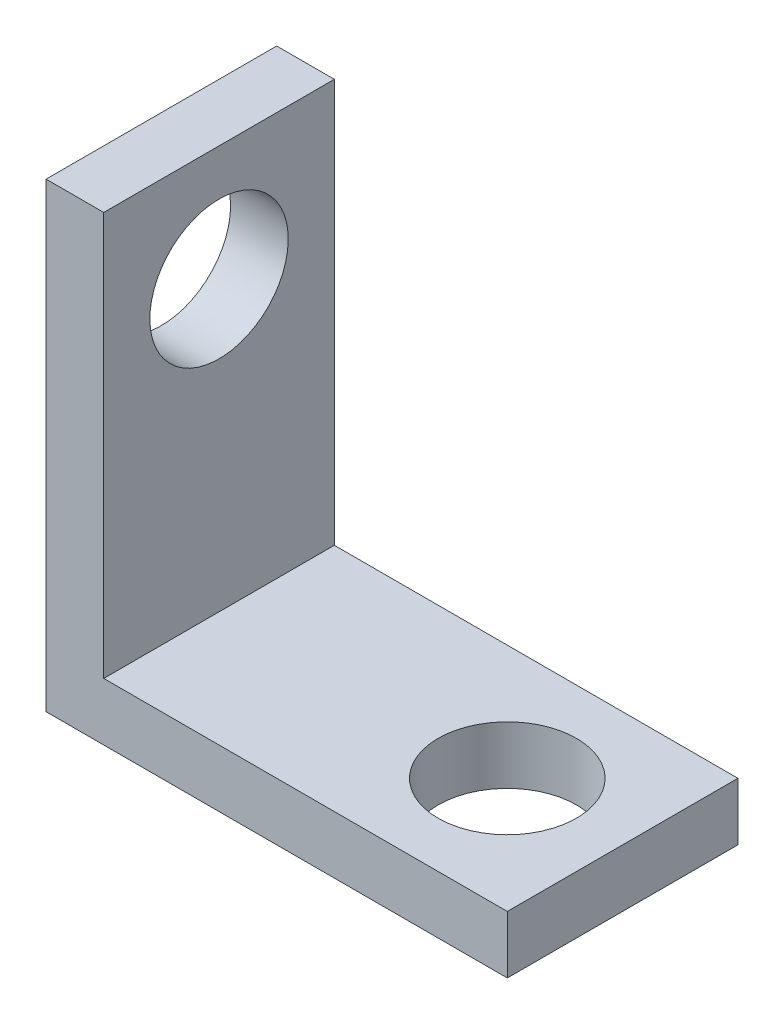
ISO-10303-21;
HEADER;
FILE_DESCRIPTION(('STEP AP214'),'2;1');
FILE_NAME('part.step','',(''),(''),'','','');
FILE_SCHEMA(('AUTOMOTIVE_DESIGN { 1 0 10303 214 1 1 1 1 }'));
ENDSEC;
DATA;
#1=APPLICATION_CONTEXT('core data for automotive mechanical design processes');
#2=APPLICATION_PROTOCOL_DEFINITION('international standard','automotive_design',2000,#1);
#3=PRODUCT_CONTEXT('',#1,'mechanical');
#4=PRODUCT('Part','Part','',(#3));
#5=PRODUCT_RELATED_PRODUCT_CATEGORY('part','',(#4));
#6=PRODUCT_DEFINITION_FORMATION('','',#4);
#7=PRODUCT_DEFINITION_CONTEXT('part definition',#1,'design');
#8=PRODUCT_DEFINITION('design','',#6,#7);
#9=PRODUCT_DEFINITION_SHAPE('','',#8);
#10=(LENGTH_UNIT() NAMED_UNIT(*) SI_UNIT(.MILLI.,.METRE.));
#11=(NAMED_UNIT(*) PLANE_ANGLE_UNIT() SI_UNIT($,.RADIAN.));
#12=(NAMED_UNIT(*) SI_UNIT($,.STERADIAN.) SOLID_ANGLE_UNIT());
#13=UNCERTAINTY_MEASURE_WITH_UNIT(LENGTH_MEASURE(1.E-05),#10,'distance_accuracy_value','');
#14=(GEOMETRIC_REPRESENTATION_CONTEXT(3) GLOBAL_UNCERTAINTY_ASSIGNED_CONTEXT((#13)) GLOBAL_UNIT_ASSIGNED_CONTEXT((#10,
#11,#12)) REPRESENTATION_CONTEXT('',''));
#15=CARTESIAN_POINT('',(0.,0.,0.));
#16=DIRECTION('',(0.,0.,1.));
#17=DIRECTION('',(1.,0.,0.));
#18=AXIS2_PLACEMENT_3D('',#15,#16,#17);
#19=CARTESIAN_POINT('',(25.4,0.,12.7));
#20=DIRECTION('',(0.,1.,0.));
#21=DIRECTION('',(-1.,0.,0.));
#22=AXIS2_PLACEMENT_3D('',#19,#20,#21);
#23=PLANE('',#22);
#24=CARTESIAN_POINT('',(19.05,0.,6.35));
#25=DIRECTION('',(0.,1.,0.));
#26=DIRECTION('',(-1.,0.,0.));
#27=AXIS2_PLACEMENT_3D('',#24,#25,#26);
#28=CIRCLE('',#27,3.81);
#29=CARTESIAN_POINT('',(15.24,0.,6.35));
#30=VERTEX_POINT('',#29);
#31=EDGE_CURVE('E134',#30,#30,#28,.T.);
#32=ORIENTED_EDGE('',*,*,#31,.T.);
#33=EDGE_LOOP('',(#32));
#34=FACE_BOUND('',#33,.T.);
#35=DIRECTION('',(1.,0.,0.));
#36=VECTOR('',#35,1.);
#37=CARTESIAN_POINT('',(25.4,0.,0.));
#38=LINE('',#37,#36);
#39=CARTESIAN_POINT('',(0.,0.,0.));
#40=VERTEX_POINT('',#39);
#41=CARTESIAN_POINT('',(25.4,0.,0.));
#42=VERTEX_POINT('',#41);
#43=EDGE_CURVE('E129',#40,#42,#38,.T.);
#44=ORIENTED_EDGE('',*,*,#43,.T.);
#45=DIRECTION('',(0.,0.,-1.));
#46=VECTOR('',#45,1.);
#47=CARTESIAN_POINT('',(25.4,0.,12.7));
#48=LINE('',#47,#46);
#49=CARTESIAN_POINT('',(25.4,0.,12.7));
#50=VERTEX_POINT('',#49);
#51=EDGE_CURVE('E11',#50,#42,#48,.T.);
#52=ORIENTED_EDGE('',*,*,#51,.F.);
#53=DIRECTION('',(1.,0.,0.));
#54=VECTOR('',#53,1.);
#55=CARTESIAN_POINT('',(25.4,0.,12.7));
#56=LINE('',#55,#54);
#57=CARTESIAN_POINT('',(0.,0.,12.7));
#58=VERTEX_POINT('',#57);
#59=EDGE_CURVE('E146',#58,#50,#56,.T.);
#60=ORIENTED_EDGE('',*,*,#59,.F.);
#61=DIRECTION('',(0.,0.,-1.));
#62=VECTOR('',#61,1.);
#63=CARTESIAN_POINT('',(0.,0.,12.7));
#64=LINE('',#63,#62);
#65=EDGE_CURVE('E125',#58,#40,#64,.T.);
#66=ORIENTED_EDGE('',*,*,#65,.T.);
#67=EDGE_LOOP('',(#44,#52,#60,#66));
#68=FACE_BOUND('',#67,.T.);
#69=ADVANCED_FACE('F39',(#34,#68),#23,.F.);
#70=CARTESIAN_POINT('',(25.4,3.175,12.7));
#71=DIRECTION('',(-1.,0.,0.));
#72=DIRECTION('',(0.,0.,1.));
#73=AXIS2_PLACEMENT_3D('',#70,#71,#72);
#74=PLANE('',#73);
#75=DIRECTION('',(0.,1.,0.));
#76=VECTOR('',#75,1.);
#77=CARTESIAN_POINT('',(25.4,3.175,0.));
#78=LINE('',#77,#76);
#79=CARTESIAN_POINT('',(25.4,3.175,0.));
#80=VERTEX_POINT('',#79);
#81=EDGE_CURVE('E133',#42,#80,#78,.T.);
#82=ORIENTED_EDGE('',*,*,#81,.T.);
#83=DIRECTION('',(0.,0.,-1.));
#84=VECTOR('',#83,1.);
#85=CARTESIAN_POINT('',(25.4,3.175,12.7));
#86=LINE('',#85,#84);
#87=CARTESIAN_POINT('',(25.4,3.175,12.7));
#88=VERTEX_POINT('',#87);
#89=EDGE_CURVE('E49',#88,#80,#86,.T.);
#90=ORIENTED_EDGE('',*,*,#89,.F.);
#91=DIRECTION('',(0.,1.,0.));
#92=VECTOR('',#91,1.);
#93=CARTESIAN_POINT('',(25.4,3.175,12.7));
#94=LINE('',#93,#92);
#95=EDGE_CURVE('E94',#50,#88,#94,.T.);
#96=ORIENTED_EDGE('',*,*,#95,.F.);
#97=ORIENTED_EDGE('',*,*,#51,.T.);
#98=EDGE_LOOP('',(#82,#90,#96,#97));
#99=FACE_BOUND('',#98,.T.);
#100=ADVANCED_FACE('F177',(#99),#74,.F.);
#101=CARTESIAN_POINT('',(3.175,3.175,12.7));
#102=DIRECTION('',(0.,-1.,0.));
#103=DIRECTION('',(1.,0.,0.));
#104=AXIS2_PLACEMENT_3D('',#101,#102,#103);
#105=PLANE('',#104);
#106=CARTESIAN_POINT('',(19.05,3.175,6.35));
#107=DIRECTION('',(0.,1.,0.));
#108=DIRECTION('',(-1.,0.,0.));
#109=AXIS2_PLACEMENT_3D('',#106,#107,#108);
#110=CIRCLE('',#109,3.81);
#111=CARTESIAN_POINT('',(15.24,3.175,6.35));
#112=VERTEX_POINT('',#111);
#113=EDGE_CURVE('E186',#112,#112,#110,.T.);
#114=ORIENTED_EDGE('',*,*,#113,.F.);
#115=EDGE_LOOP('',(#114));
#116=FACE_BOUND('',#115,.T.);
#117=DIRECTION('',(-1.,0.,0.));
#118=VECTOR('',#117,1.);
#119=CARTESIAN_POINT('',(3.175,3.175,0.));
#120=LINE('',#119,#118);
#121=CARTESIAN_POINT('',(3.175,3.175,0.));
#122=VERTEX_POINT('',#121);
#123=EDGE_CURVE('E137',#80,#122,#120,.T.);
#124=ORIENTED_EDGE('',*,*,#123,.T.);
#125=DIRECTION('',(0.,0.,-1.));
#126=VECTOR('',#125,1.);
#127=CARTESIAN_POINT('',(3.175,3.175,12.7));
#128=LINE('',#127,#126);
#129=CARTESIAN_POINT('',(3.175,3.175,12.7));
#130=VERTEX_POINT('',#129);
#131=EDGE_CURVE('E118',#130,#122,#128,.T.);
#132=ORIENTED_EDGE('',*,*,#131,.F.);
#133=DIRECTION('',(-1.,0.,0.));
#134=VECTOR('',#133,1.);
#135=CARTESIAN_POINT('',(3.175,3.175,12.7));
#136=LINE('',#135,#134);
#137=EDGE_CURVE('E107',#88,#130,#136,.T.);
#138=ORIENTED_EDGE('',*,*,#137,.F.);
#139=ORIENTED_EDGE('',*,*,#89,.T.);
#140=EDGE_LOOP('',(#124,#132,#138,#139));
#141=FACE_BOUND('',#140,.T.);
#142=ADVANCED_FACE('F157',(#116,#141),#105,.F.);
#143=CARTESIAN_POINT('',(3.175,25.4,12.7));
#144=DIRECTION('',(-1.,0.,0.));
#145=DIRECTION('',(0.,-1.,0.));
#146=AXIS2_PLACEMENT_3D('',#143,#144,#145);
#147=PLANE('',#146);
#148=CARTESIAN_POINT('',(3.175,19.05,6.35));
#149=DIRECTION('',(1.,0.,0.));
#150=DIRECTION('',(0.,1.,0.));
#151=AXIS2_PLACEMENT_3D('',#148,#149,#150);
#152=CIRCLE('',#151,3.81);
#153=CARTESIAN_POINT('',(3.175,22.86,6.35));
#154=VERTEX_POINT('',#153);
#155=EDGE_CURVE('E197',#154,#154,#152,.T.);
#156=ORIENTED_EDGE('',*,*,#155,.F.);
#157=EDGE_LOOP('',(#156));
#158=FACE_BOUND('',#157,.T.);
#159=DIRECTION('',(0.,1.,0.));
#160=VECTOR('',#159,1.);
#161=CARTESIAN_POINT('',(3.175,25.4,0.));
#162=LINE('',#161,#160);
#163=CARTESIAN_POINT('',(3.175,25.4,0.));
#164=VERTEX_POINT('',#163);
#165=EDGE_CURVE('E116',#122,#164,#162,.T.);
#166=ORIENTED_EDGE('',*,*,#165,.T.);
#167=DIRECTION('',(0.,0.,-1.));
#168=VECTOR('',#167,1.);
#169=CARTESIAN_POINT('',(3.175,25.4,12.7));
#170=LINE('',#169,#168);
#171=CARTESIAN_POINT('',(3.175,25.4,12.7));
#172=VERTEX_POINT('',#171);
#173=EDGE_CURVE('E113',#172,#164,#170,.T.);
#174=ORIENTED_EDGE('',*,*,#173,.F.);
#175=DIRECTION('',(0.,1.,0.));
#176=VECTOR('',#175,1.);
#177=CARTESIAN_POINT('',(3.175,25.4,12.7));
#178=LINE('',#177,#176);
#179=EDGE_CURVE('E101',#130,#172,#178,.T.);
#180=ORIENTED_EDGE('',*,*,#179,.F.);
#181=ORIENTED_EDGE('',*,*,#131,.T.);
#182=EDGE_LOOP('',(#166,#174,#180,#181));
#183=FACE_BOUND('',#182,.T.);
#184=ADVANCED_FACE('F114',(#158,#183),#147,.F.);
#185=CARTESIAN_POINT('',(0.,25.4,12.7));
#186=DIRECTION('',(0.,-1.,0.));
#187=DIRECTION('',(0.,0.,-1.));
#188=AXIS2_PLACEMENT_3D('',#185,#186,#187);
#189=PLANE('',#188);
#190=DIRECTION('',(-1.,0.,0.));
#191=VECTOR('',#190,1.);
#192=CARTESIAN_POINT('',(0.,25.4,0.));
#193=LINE('',#192,#191);
#194=CARTESIAN_POINT('',(0.,25.4,0.));
#195=VERTEX_POINT('',#194);
#196=EDGE_CURVE('E80',#164,#195,#193,.T.);
#197=ORIENTED_EDGE('',*,*,#196,.T.);
#198=DIRECTION('',(0.,0.,-1.));
#199=VECTOR('',#198,1.);
#200=CARTESIAN_POINT('',(0.,25.4,12.7));
#201=LINE('',#200,#199);
#202=CARTESIAN_POINT('',(0.,25.4,12.7));
#203=VERTEX_POINT('',#202);
#204=EDGE_CURVE('E119',#203,#195,#201,.T.);
#205=ORIENTED_EDGE('',*,*,#204,.F.);
#206=DIRECTION('',(-1.,0.,0.));
#207=VECTOR('',#206,1.);
#208=CARTESIAN_POINT('',(0.,25.4,12.7));
#209=LINE('',#208,#207);
#210=EDGE_CURVE('E105',#172,#203,#209,.T.);
#211=ORIENTED_EDGE('',*,*,#210,.F.);
#212=ORIENTED_EDGE('',*,*,#173,.T.);
#213=EDGE_LOOP('',(#197,#205,#211,#212));
#214=FACE_BOUND('',#213,.T.);
#215=ADVANCED_FACE('F121',(#214),#189,.F.);
#216=CARTESIAN_POINT('',(0.,0.,12.7));
#217=DIRECTION('',(1.,0.,0.));
#218=DIRECTION('',(0.,0.,-1.));
#219=AXIS2_PLACEMENT_3D('',#216,#217,#218);
#220=PLANE('',#219);
#221=CARTESIAN_POINT('',(0.,19.05,6.35));
#222=DIRECTION('',(1.,0.,0.));
#223=DIRECTION('',(0.,0.,-1.));
#224=AXIS2_PLACEMENT_3D('',#221,#222,#223);
#225=CIRCLE('',#224,3.81);
#226=CARTESIAN_POINT('',(0.,19.05,2.54));
#227=VERTEX_POINT('',#226);
#228=EDGE_CURVE('E42',#227,#227,#225,.T.);
#229=ORIENTED_EDGE('',*,*,#228,.T.);
#230=EDGE_LOOP('',(#229));
#231=FACE_BOUND('',#230,.T.);
#232=DIRECTION('',(0.,-1.,0.));
#233=VECTOR('',#232,1.);
#234=CARTESIAN_POINT('',(0.,0.,0.));
#235=LINE('',#234,#233);
#236=EDGE_CURVE('E86',#195,#40,#235,.T.);
#237=ORIENTED_EDGE('',*,*,#236,.T.);
#238=ORIENTED_EDGE('',*,*,#65,.F.);
#239=DIRECTION('',(0.,-1.,0.));
#240=VECTOR('',#239,1.);
#241=CARTESIAN_POINT('',(0.,0.,12.7));
#242=LINE('',#241,#240);
#243=EDGE_CURVE('E57',#203,#58,#242,.T.);
#244=ORIENTED_EDGE('',*,*,#243,.F.);
#245=ORIENTED_EDGE('',*,*,#204,.T.);
#246=EDGE_LOOP('',(#237,#238,#244,#245));
#247=FACE_BOUND('',#246,.T.);
#248=ADVANCED_FACE('F164',(#231,#247),#220,.F.);
#249=CARTESIAN_POINT('',(0.,0.,12.7));
#250=DIRECTION('',(0.,0.,-1.));
#251=DIRECTION('',(-1.,0.,0.));
#252=AXIS2_PLACEMENT_3D('',#249,#250,#251);
#253=PLANE('',#252);
#254=ORIENTED_EDGE('',*,*,#59,.T.);
#255=ORIENTED_EDGE('',*,*,#95,.T.);
#256=ORIENTED_EDGE('',*,*,#137,.T.);
#257=ORIENTED_EDGE('',*,*,#179,.T.);
#258=ORIENTED_EDGE('',*,*,#210,.T.);
#259=ORIENTED_EDGE('',*,*,#243,.T.);
#260=EDGE_LOOP('',(#254,#255,#256,#257,#258,#259));
#261=FACE_BOUND('',#260,.T.);
#262=ADVANCED_FACE('F103',(#261),#253,.F.);
#263=CARTESIAN_POINT('',(0.,0.,0.));
#264=DIRECTION('',(0.,0.,-1.));
#265=DIRECTION('',(-1.,0.,0.));
#266=AXIS2_PLACEMENT_3D('',#263,#264,#265);
#267=PLANE('',#266);
#268=ORIENTED_EDGE('',*,*,#43,.F.);
#269=ORIENTED_EDGE('',*,*,#236,.F.);
#270=ORIENTED_EDGE('',*,*,#196,.F.);
#271=ORIENTED_EDGE('',*,*,#165,.F.);
#272=ORIENTED_EDGE('',*,*,#123,.F.);
#273=ORIENTED_EDGE('',*,*,#81,.F.);
#274=EDGE_LOOP('',(#268,#269,#270,#271,#272,#273));
#275=FACE_BOUND('',#274,.T.);
#276=ADVANCED_FACE('F160',(#275),#267,.T.);
#277=CARTESIAN_POINT('',(19.05,-9.525,6.35));
#278=DIRECTION('',(0.,1.,0.));
#279=DIRECTION('',(-1.,0.,0.));
#280=AXIS2_PLACEMENT_3D('',#277,#278,#279);
#281=CYLINDRICAL_SURFACE('',#280,3.81);
#282=ORIENTED_EDGE('',*,*,#113,.T.);
#283=EDGE_LOOP('',(#282));
#284=FACE_BOUND('',#283,.T.);
#285=ORIENTED_EDGE('',*,*,#31,.F.);
#286=EDGE_LOOP('',(#285));
#287=FACE_BOUND('',#286,.T.);
#288=ADVANCED_FACE('F207',(#284,#287),#281,.F.);
#289=CARTESIAN_POINT('',(-9.525,19.05,6.35));
#290=DIRECTION('',(1.,0.,0.));
#291=DIRECTION('',(0.,1.,0.));
#292=AXIS2_PLACEMENT_3D('',#289,#290,#291);
#293=CYLINDRICAL_SURFACE('',#292,3.81);
#294=ORIENTED_EDGE('',*,*,#155,.T.);
#295=EDGE_LOOP('',(#294));
#296=FACE_BOUND('',#295,.T.);
#297=ORIENTED_EDGE('',*,*,#228,.F.);
#298=EDGE_LOOP('',(#297));
#299=FACE_BOUND('',#298,.T.);
#300=ADVANCED_FACE('F205',(#296,#299),#293,.F.);
#301=CLOSED_SHELL('',(#69,#100,#142,#184,#215,#248,#262,#276,#288,#300));
#302=MANIFOLD_SOLID_BREP('B2',#301);
#303=ADVANCED_BREP_SHAPE_REPRESENTATION('',(#18,#302),#14);
#304=SHAPE_DEFINITION_REPRESENTATION(#9,#303);
ENDSEC;
END-ISO-10303-21;
